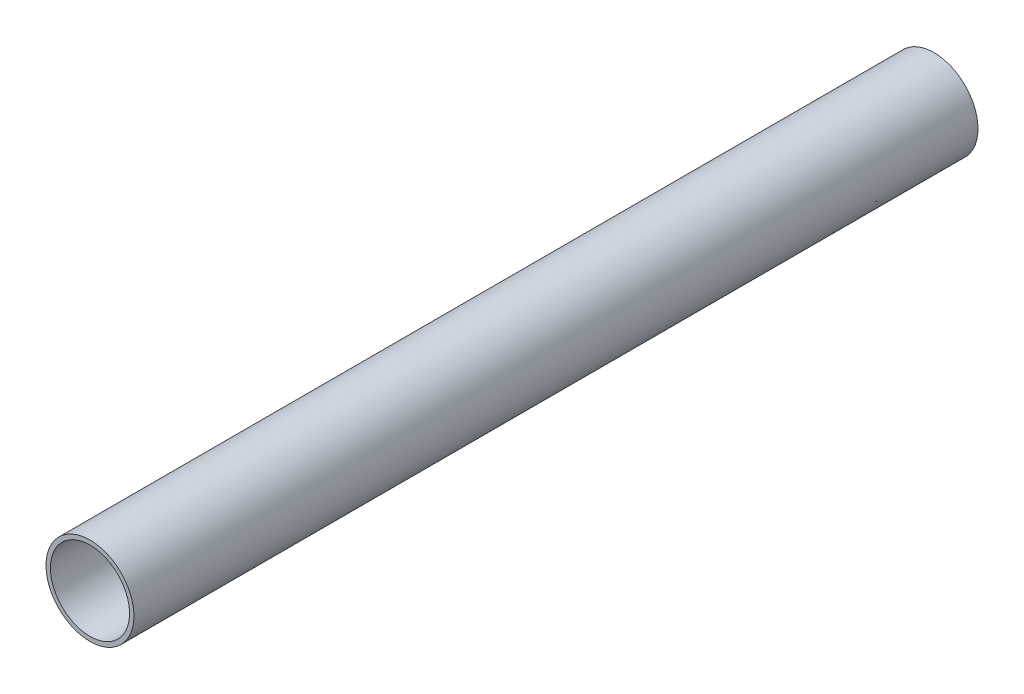
ISO-10303-21;
HEADER;
FILE_DESCRIPTION(('STEP AP214'),'2;1');
FILE_NAME('part.step','',(''),(''),'','','');
FILE_SCHEMA(('AUTOMOTIVE_DESIGN { 1 0 10303 214 1 1 1 1 }'));
ENDSEC;
DATA;
#1=APPLICATION_CONTEXT('core data for automotive mechanical design processes');
#2=APPLICATION_PROTOCOL_DEFINITION('international standard','automotive_design',2000,#1);
#3=PRODUCT_CONTEXT('',#1,'mechanical');
#4=PRODUCT('Part','Part','',(#3));
#5=PRODUCT_RELATED_PRODUCT_CATEGORY('part','',(#4));
#6=PRODUCT_DEFINITION_FORMATION('','',#4);
#7=PRODUCT_DEFINITION_CONTEXT('part definition',#1,'design');
#8=PRODUCT_DEFINITION('design','',#6,#7);
#9=PRODUCT_DEFINITION_SHAPE('','',#8);
#10=(LENGTH_UNIT() NAMED_UNIT(*) SI_UNIT(.MILLI.,.METRE.));
#11=(NAMED_UNIT(*) PLANE_ANGLE_UNIT() SI_UNIT($,.RADIAN.));
#12=(NAMED_UNIT(*) SI_UNIT($,.STERADIAN.) SOLID_ANGLE_UNIT());
#13=UNCERTAINTY_MEASURE_WITH_UNIT(LENGTH_MEASURE(1.E-05),#10,'distance_accuracy_value','');
#14=(GEOMETRIC_REPRESENTATION_CONTEXT(3) GLOBAL_UNCERTAINTY_ASSIGNED_CONTEXT((#13)) GLOBAL_UNIT_ASSIGNED_CONTEXT((#10,
#11,#12)) REPRESENTATION_CONTEXT('',''));
#15=CARTESIAN_POINT('',(0.,0.,0.));
#16=DIRECTION('',(0.,0.,1.));
#17=DIRECTION('',(1.,0.,0.));
#18=AXIS2_PLACEMENT_3D('',#15,#16,#17);
#19=CARTESIAN_POINT('',(0.,0.,914.4));
#20=DIRECTION('',(0.,0.,-1.));
#21=DIRECTION('',(-1.,0.,0.));
#22=AXIS2_PLACEMENT_3D('',#19,#20,#21);
#23=CYLINDRICAL_SURFACE('',#22,15.875);
#24=CARTESIAN_POINT('',(0.,0.,0.));
#25=DIRECTION('',(0.,0.,1.));
#26=DIRECTION('',(1.,0.,0.));
#27=AXIS2_PLACEMENT_3D('',#24,#25,#26);
#28=CIRCLE('',#27,15.875);
#29=CARTESIAN_POINT('',(15.875,0.,0.));
#30=VERTEX_POINT('',#29);
#31=EDGE_CURVE('E10',#30,#30,#28,.T.);
#32=ORIENTED_EDGE('',*,*,#31,.T.);
#33=EDGE_LOOP('',(#32));
#34=FACE_BOUND('',#33,.T.);
#35=CARTESIAN_POINT('',(0.,0.,304.8));
#36=DIRECTION('',(0.,0.,-1.));
#37=DIRECTION('',(-1.,0.,0.));
#38=AXIS2_PLACEMENT_3D('',#35,#36,#37);
#39=CIRCLE('',#38,15.875);
#40=CARTESIAN_POINT('',(-15.875,0.,304.8));
#41=VERTEX_POINT('',#40);
#42=EDGE_CURVE('E41',#41,#41,#39,.T.);
#43=ORIENTED_EDGE('',*,*,#42,.T.);
#44=EDGE_LOOP('',(#43));
#45=FACE_BOUND('',#44,.T.);
#46=ADVANCED_FACE('F30',(#34,#45),#23,.T.);
#47=CARTESIAN_POINT('',(0.,0.,0.));
#48=DIRECTION('',(0.,0.,1.));
#49=DIRECTION('',(1.,0.,0.));
#50=AXIS2_PLACEMENT_3D('',#47,#48,#49);
#51=PLANE('',#50);
#52=ORIENTED_EDGE('',*,*,#31,.F.);
#53=EDGE_LOOP('',(#52));
#54=FACE_BOUND('',#53,.T.);
#55=CARTESIAN_POINT('',(0.,0.,0.));
#56=DIRECTION('',(0.,0.,1.));
#57=DIRECTION('',(1.,0.,0.));
#58=AXIS2_PLACEMENT_3D('',#55,#56,#57);
#59=CIRCLE('',#58,14.2875);
#60=CARTESIAN_POINT('',(14.2875,0.,0.));
#61=VERTEX_POINT('',#60);
#62=EDGE_CURVE('E37',#61,#61,#59,.T.);
#63=ORIENTED_EDGE('',*,*,#62,.T.);
#64=EDGE_LOOP('',(#63));
#65=FACE_BOUND('',#64,.T.);
#66=ADVANCED_FACE('F56',(#54,#65),#51,.F.);
#67=CARTESIAN_POINT('',(0.,0.,914.4));
#68=DIRECTION('',(0.,0.,-1.));
#69=DIRECTION('',(-1.,0.,0.));
#70=AXIS2_PLACEMENT_3D('',#67,#68,#69);
#71=CYLINDRICAL_SURFACE('',#70,14.2875);
#72=CARTESIAN_POINT('',(0.,0.,304.8));
#73=DIRECTION('',(0.,0.,-1.));
#74=DIRECTION('',(-1.,0.,0.));
#75=AXIS2_PLACEMENT_3D('',#72,#73,#74);
#76=CIRCLE('',#75,14.2875);
#77=CARTESIAN_POINT('',(-14.2875,0.,304.8));
#78=VERTEX_POINT('',#77);
#79=EDGE_CURVE('E33',#78,#78,#76,.T.);
#80=ORIENTED_EDGE('',*,*,#79,.F.);
#81=EDGE_LOOP('',(#80));
#82=FACE_BOUND('',#81,.T.);
#83=ORIENTED_EDGE('',*,*,#62,.F.);
#84=EDGE_LOOP('',(#83));
#85=FACE_BOUND('',#84,.T.);
#86=ADVANCED_FACE('F53',(#82,#85),#71,.F.);
#87=CARTESIAN_POINT('',(-15.875,15.875,304.8));
#88=DIRECTION('',(0.,0.,-1.));
#89=DIRECTION('',(-1.,0.,0.));
#90=AXIS2_PLACEMENT_3D('',#87,#88,#89);
#91=PLANE('',#90);
#92=ORIENTED_EDGE('',*,*,#79,.T.);
#93=EDGE_LOOP('',(#92));
#94=FACE_BOUND('',#93,.T.);
#95=ORIENTED_EDGE('',*,*,#42,.F.);
#96=EDGE_LOOP('',(#95));
#97=FACE_BOUND('',#96,.T.);
#98=ADVANCED_FACE('F50',(#94,#97),#91,.F.);
#99=CLOSED_SHELL('',(#46,#66,#86,#98));
#100=MANIFOLD_SOLID_BREP('B2',#99);
#101=ADVANCED_BREP_SHAPE_REPRESENTATION('',(#18,#100),#14);
#102=SHAPE_DEFINITION_REPRESENTATION(#9,#101);
ENDSEC;
END-ISO-10303-21;
